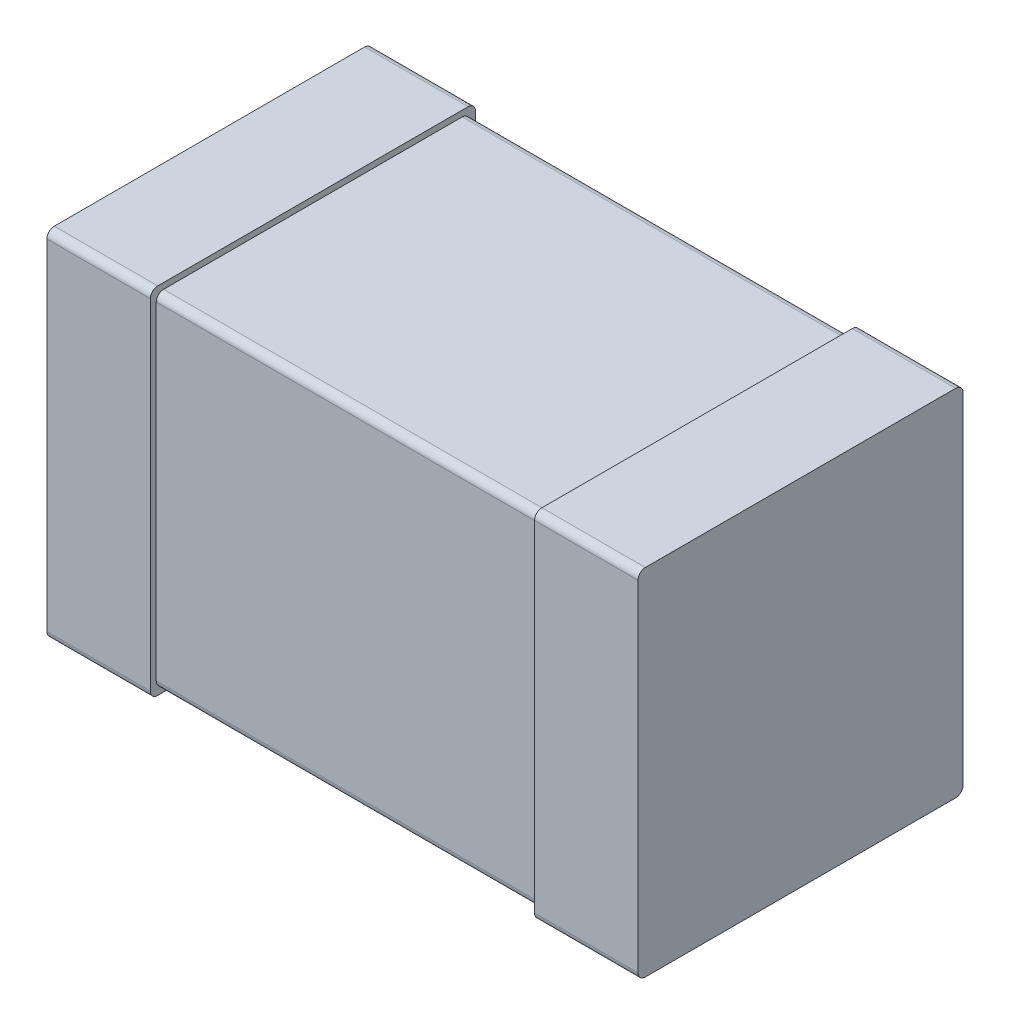
ISO-10303-21;
HEADER;
FILE_DESCRIPTION(('STEP AP214'),'2;1');
FILE_NAME('part.step','',(''),(''),'','','');
FILE_SCHEMA(('AUTOMOTIVE_DESIGN { 1 0 10303 214 1 1 1 1 }'));
ENDSEC;
DATA;
#1=APPLICATION_CONTEXT('core data for automotive mechanical design processes');
#2=APPLICATION_PROTOCOL_DEFINITION('international standard','automotive_design',2000,#1);
#3=PRODUCT_CONTEXT('',#1,'mechanical');
#4=PRODUCT('Part','Part','',(#3));
#5=PRODUCT_RELATED_PRODUCT_CATEGORY('part','',(#4));
#6=PRODUCT_DEFINITION_FORMATION('','',#4);
#7=PRODUCT_DEFINITION_CONTEXT('part definition',#1,'design');
#8=PRODUCT_DEFINITION('design','',#6,#7);
#9=PRODUCT_DEFINITION_SHAPE('','',#8);
#10=(LENGTH_UNIT() NAMED_UNIT(*) SI_UNIT(.MILLI.,.METRE.));
#11=(NAMED_UNIT(*) PLANE_ANGLE_UNIT() SI_UNIT($,.RADIAN.));
#12=(NAMED_UNIT(*) SI_UNIT($,.STERADIAN.) SOLID_ANGLE_UNIT());
#13=UNCERTAINTY_MEASURE_WITH_UNIT(LENGTH_MEASURE(1.E-05),#10,'distance_accuracy_value','');
#14=(GEOMETRIC_REPRESENTATION_CONTEXT(3) GLOBAL_UNCERTAINTY_ASSIGNED_CONTEXT((#13)) GLOBAL_UNIT_ASSIGNED_CONTEXT((#10,
#11,#12)) REPRESENTATION_CONTEXT('',''));
#15=CARTESIAN_POINT('',(0.,0.,0.));
#16=DIRECTION('',(0.,0.,1.));
#17=DIRECTION('',(1.,0.,0.));
#18=AXIS2_PLACEMENT_3D('',#15,#16,#17);
#19=CARTESIAN_POINT('',(-1.,-0.6,0.));
#20=DIRECTION('',(1.,0.,0.));
#21=DIRECTION('',(0.,0.,-1.));
#22=AXIS2_PLACEMENT_3D('',#19,#20,#21);
#23=PLANE('',#22);
#24=DIRECTION('',(0.,1.,0.));
#25=VECTOR('',#24,1.);
#26=CARTESIAN_POINT('',(-1.,-0.6,1.1));
#27=LINE('',#26,#25);
#28=CARTESIAN_POINT('',(-1.,0.575,1.1));
#29=VERTEX_POINT('',#28);
#30=CARTESIAN_POINT('',(-1.,-0.575,1.1));
#31=VERTEX_POINT('',#30);
#32=EDGE_CURVE('E294',#29,#31,#27,.F.);
#33=ORIENTED_EDGE('',*,*,#32,.F.);
#34=CARTESIAN_POINT('',(-1.,0.575,1.075));
#35=DIRECTION('',(1.,0.,0.));
#36=DIRECTION('',(0.,0.,-1.));
#37=AXIS2_PLACEMENT_3D('',#34,#35,#36);
#38=CIRCLE('',#37,0.025);
#39=CARTESIAN_POINT('',(-1.,0.6,1.075));
#40=VERTEX_POINT('',#39);
#41=EDGE_CURVE('E298',#40,#29,#38,.T.);
#42=ORIENTED_EDGE('',*,*,#41,.F.);
#43=DIRECTION('',(0.,0.,1.));
#44=VECTOR('',#43,1.);
#45=CARTESIAN_POINT('',(-1.,0.6,0.));
#46=LINE('',#45,#44);
#47=CARTESIAN_POINT('',(-1.,0.6,0.025));
#48=VERTEX_POINT('',#47);
#49=EDGE_CURVE('E302',#48,#40,#46,.T.);
#50=ORIENTED_EDGE('',*,*,#49,.F.);
#51=CARTESIAN_POINT('',(-1.,0.575,0.025));
#52=DIRECTION('',(1.,0.,0.));
#53=DIRECTION('',(0.,0.,-1.));
#54=AXIS2_PLACEMENT_3D('',#51,#52,#53);
#55=CIRCLE('',#54,0.025);
#56=CARTESIAN_POINT('',(-1.,0.575,0.));
#57=VERTEX_POINT('',#56);
#58=EDGE_CURVE('E303',#57,#48,#55,.T.);
#59=ORIENTED_EDGE('',*,*,#58,.F.);
#60=DIRECTION('',(0.,1.,0.));
#61=VECTOR('',#60,1.);
#62=CARTESIAN_POINT('',(-1.,-0.6,0.));
#63=LINE('',#62,#61);
#64=CARTESIAN_POINT('',(-1.,-0.575,0.));
#65=VERTEX_POINT('',#64);
#66=EDGE_CURVE('E310',#57,#65,#63,.F.);
#67=ORIENTED_EDGE('',*,*,#66,.T.);
#68=CARTESIAN_POINT('',(-1.,-0.575,0.025));
#69=DIRECTION('',(1.,0.,0.));
#70=DIRECTION('',(0.,0.,-1.));
#71=AXIS2_PLACEMENT_3D('',#68,#69,#70);
#72=CIRCLE('',#71,0.025);
#73=CARTESIAN_POINT('',(-1.,-0.6,0.025));
#74=VERTEX_POINT('',#73);
#75=EDGE_CURVE('E314',#74,#65,#72,.T.);
#76=ORIENTED_EDGE('',*,*,#75,.F.);
#77=DIRECTION('',(0.,0.,1.));
#78=VECTOR('',#77,1.);
#79=CARTESIAN_POINT('',(-1.,-0.6,0.));
#80=LINE('',#79,#78);
#81=CARTESIAN_POINT('',(-1.,-0.6,1.075));
#82=VERTEX_POINT('',#81);
#83=EDGE_CURVE('E323',#74,#82,#80,.T.);
#84=ORIENTED_EDGE('',*,*,#83,.T.);
#85=CARTESIAN_POINT('',(-1.,-0.575,1.075));
#86=DIRECTION('',(1.,0.,0.));
#87=DIRECTION('',(0.,0.,-1.));
#88=AXIS2_PLACEMENT_3D('',#85,#86,#87);
#89=CIRCLE('',#88,0.025);
#90=EDGE_CURVE('E291',#31,#82,#89,.T.);
#91=ORIENTED_EDGE('',*,*,#90,.F.);
#92=EDGE_LOOP('',(#33,#42,#50,#59,#67,#76,#84,#91));
#93=FACE_BOUND('',#92,.T.);
#94=ADVANCED_FACE('F17',(#93),#23,.F.);
#95=CARTESIAN_POINT('',(1.,-0.6,0.));
#96=DIRECTION('',(1.,0.,0.));
#97=DIRECTION('',(0.,0.,-1.));
#98=AXIS2_PLACEMENT_3D('',#95,#96,#97);
#99=PLANE('',#98);
#100=DIRECTION('',(0.,1.,0.));
#101=VECTOR('',#100,1.);
#102=CARTESIAN_POINT('',(1.,-0.6,1.1));
#103=LINE('',#102,#101);
#104=CARTESIAN_POINT('',(1.,-0.575,1.1));
#105=VERTEX_POINT('',#104);
#106=CARTESIAN_POINT('',(1.,0.575,1.1));
#107=VERTEX_POINT('',#106);
#108=EDGE_CURVE('E268',#105,#107,#103,.T.);
#109=ORIENTED_EDGE('',*,*,#108,.F.);
#110=CARTESIAN_POINT('',(1.,-0.575,1.075));
#111=DIRECTION('',(1.,0.,0.));
#112=DIRECTION('',(0.,0.,-1.));
#113=AXIS2_PLACEMENT_3D('',#110,#111,#112);
#114=CIRCLE('',#113,0.025);
#115=CARTESIAN_POINT('',(1.,-0.6,1.075));
#116=VERTEX_POINT('',#115);
#117=EDGE_CURVE('E262',#116,#105,#114,.F.);
#118=ORIENTED_EDGE('',*,*,#117,.F.);
#119=DIRECTION('',(0.,0.,1.));
#120=VECTOR('',#119,1.);
#121=CARTESIAN_POINT('',(1.,-0.6,0.));
#122=LINE('',#121,#120);
#123=CARTESIAN_POINT('',(1.,-0.6,0.025));
#124=VERTEX_POINT('',#123);
#125=EDGE_CURVE('E316',#116,#124,#122,.F.);
#126=ORIENTED_EDGE('',*,*,#125,.T.);
#127=CARTESIAN_POINT('',(1.,-0.575,0.025));
#128=DIRECTION('',(1.,0.,0.));
#129=DIRECTION('',(0.,0.,-1.));
#130=AXIS2_PLACEMENT_3D('',#127,#128,#129);
#131=CIRCLE('',#130,0.025);
#132=CARTESIAN_POINT('',(1.,-0.575,0.));
#133=VERTEX_POINT('',#132);
#134=EDGE_CURVE('E284',#133,#124,#131,.F.);
#135=ORIENTED_EDGE('',*,*,#134,.F.);
#136=DIRECTION('',(0.,1.,0.));
#137=VECTOR('',#136,1.);
#138=CARTESIAN_POINT('',(1.,-0.6,0.));
#139=LINE('',#138,#137);
#140=CARTESIAN_POINT('',(1.,0.575,0.));
#141=VERTEX_POINT('',#140);
#142=EDGE_CURVE('E281',#133,#141,#139,.T.);
#143=ORIENTED_EDGE('',*,*,#142,.T.);
#144=CARTESIAN_POINT('',(1.,0.575,0.025));
#145=DIRECTION('',(1.,0.,0.));
#146=DIRECTION('',(0.,0.,-1.));
#147=AXIS2_PLACEMENT_3D('',#144,#145,#146);
#148=CIRCLE('',#147,0.025);
#149=CARTESIAN_POINT('',(1.,0.6,0.025));
#150=VERTEX_POINT('',#149);
#151=EDGE_CURVE('E277',#150,#141,#148,.F.);
#152=ORIENTED_EDGE('',*,*,#151,.F.);
#153=DIRECTION('',(0.,0.,1.));
#154=VECTOR('',#153,1.);
#155=CARTESIAN_POINT('',(1.,0.6,0.));
#156=LINE('',#155,#154);
#157=CARTESIAN_POINT('',(1.,0.6,1.075));
#158=VERTEX_POINT('',#157);
#159=EDGE_CURVE('E274',#158,#150,#156,.F.);
#160=ORIENTED_EDGE('',*,*,#159,.F.);
#161=CARTESIAN_POINT('',(1.,0.575,1.075));
#162=DIRECTION('',(1.,0.,0.));
#163=DIRECTION('',(0.,0.,-1.));
#164=AXIS2_PLACEMENT_3D('',#161,#162,#163);
#165=CIRCLE('',#164,0.025);
#166=EDGE_CURVE('E271',#107,#158,#165,.F.);
#167=ORIENTED_EDGE('',*,*,#166,.F.);
#168=EDGE_LOOP('',(#109,#118,#126,#135,#143,#152,#160,#167));
#169=FACE_BOUND('',#168,.T.);
#170=ADVANCED_FACE('F392',(#169),#99,.T.);
#171=CARTESIAN_POINT('',(-0.65,-0.555,1.055));
#172=DIRECTION('',(1.,0.,0.));
#173=DIRECTION('',(0.,0.,-1.));
#174=AXIS2_PLACEMENT_3D('',#171,#172,#173);
#175=CYLINDRICAL_SURFACE('',#174,0.025);
#176=DIRECTION('',(1.,0.,0.));
#177=VECTOR('',#176,1.);
#178=CARTESIAN_POINT('',(-0.65,-0.555,1.08));
#179=LINE('',#178,#177);
#180=CARTESIAN_POINT('',(-0.65,-0.555,1.08));
#181=VERTEX_POINT('',#180);
#182=CARTESIAN_POINT('',(0.65,-0.555,1.08));
#183=VERTEX_POINT('',#182);
#184=EDGE_CURVE('E177',#181,#183,#179,.T.);
#185=ORIENTED_EDGE('',*,*,#184,.F.);
#186=CARTESIAN_POINT('',(-0.65,-0.555,1.055));
#187=DIRECTION('',(1.,0.,0.));
#188=DIRECTION('',(0.,0.,-1.));
#189=AXIS2_PLACEMENT_3D('',#186,#187,#188);
#190=CIRCLE('',#189,0.025);
#191=CARTESIAN_POINT('',(-0.65,-0.58,1.055));
#192=VERTEX_POINT('',#191);
#193=EDGE_CURVE('E182',#181,#192,#190,.T.);
#194=ORIENTED_EDGE('',*,*,#193,.T.);
#195=DIRECTION('',(1.,0.,0.));
#196=VECTOR('',#195,1.);
#197=CARTESIAN_POINT('',(-0.65,-0.58,1.055));
#198=LINE('',#197,#196);
#199=CARTESIAN_POINT('',(0.65,-0.58,1.055));
#200=VERTEX_POINT('',#199);
#201=EDGE_CURVE('E180',#192,#200,#198,.T.);
#202=ORIENTED_EDGE('',*,*,#201,.T.);
#203=CARTESIAN_POINT('',(0.65,-0.555,1.055));
#204=DIRECTION('',(1.,0.,0.));
#205=DIRECTION('',(0.,0.,-1.));
#206=AXIS2_PLACEMENT_3D('',#203,#204,#205);
#207=CIRCLE('',#206,0.025);
#208=EDGE_CURVE('E20',#200,#183,#207,.F.);
#209=ORIENTED_EDGE('',*,*,#208,.T.);
#210=EDGE_LOOP('',(#185,#194,#202,#209));
#211=FACE_BOUND('',#210,.T.);
#212=ADVANCED_FACE('F176',(#211),#175,.T.);
#213=CARTESIAN_POINT('',(-0.65,0.555,1.055));
#214=DIRECTION('',(1.,0.,0.));
#215=DIRECTION('',(0.,0.,-1.));
#216=AXIS2_PLACEMENT_3D('',#213,#214,#215);
#217=CYLINDRICAL_SURFACE('',#216,0.025);
#218=CARTESIAN_POINT('',(0.65,0.555,1.055));
#219=DIRECTION('',(1.,0.,0.));
#220=DIRECTION('',(0.,0.,-1.));
#221=AXIS2_PLACEMENT_3D('',#218,#219,#220);
#222=CIRCLE('',#221,0.025);
#223=CARTESIAN_POINT('',(0.65,0.555,1.08));
#224=VERTEX_POINT('',#223);
#225=CARTESIAN_POINT('',(0.65,0.58,1.055));
#226=VERTEX_POINT('',#225);
#227=EDGE_CURVE('E195',#224,#226,#222,.F.);
#228=ORIENTED_EDGE('',*,*,#227,.T.);
#229=DIRECTION('',(1.,0.,0.));
#230=VECTOR('',#229,1.);
#231=CARTESIAN_POINT('',(-0.65,0.58,1.055));
#232=LINE('',#231,#230);
#233=CARTESIAN_POINT('',(-0.65,0.58,1.055));
#234=VERTEX_POINT('',#233);
#235=EDGE_CURVE('E252',#234,#226,#232,.T.);
#236=ORIENTED_EDGE('',*,*,#235,.F.);
#237=CARTESIAN_POINT('',(-0.65,0.555,1.055));
#238=DIRECTION('',(1.,0.,0.));
#239=DIRECTION('',(0.,0.,-1.));
#240=AXIS2_PLACEMENT_3D('',#237,#238,#239);
#241=CIRCLE('',#240,0.025);
#242=CARTESIAN_POINT('',(-0.65,0.555,1.08));
#243=VERTEX_POINT('',#242);
#244=EDGE_CURVE('E357',#234,#243,#241,.T.);
#245=ORIENTED_EDGE('',*,*,#244,.T.);
#246=DIRECTION('',(1.,0.,0.));
#247=VECTOR('',#246,1.);
#248=CARTESIAN_POINT('',(-0.65,0.555,1.08));
#249=LINE('',#248,#247);
#250=EDGE_CURVE('E190',#224,#243,#249,.F.);
#251=ORIENTED_EDGE('',*,*,#250,.F.);
#252=EDGE_LOOP('',(#228,#236,#245,#251));
#253=FACE_BOUND('',#252,.T.);
#254=ADVANCED_FACE('F380',(#253),#217,.T.);
#255=CARTESIAN_POINT('',(-1.,-0.6,0.));
#256=DIRECTION('',(0.,1.,0.));
#257=DIRECTION('',(0.,0.,1.));
#258=AXIS2_PLACEMENT_3D('',#255,#256,#257);
#259=PLANE('',#258);
#260=ORIENTED_EDGE('',*,*,#83,.F.);
#261=DIRECTION('',(1.,0.,0.));
#262=VECTOR('',#261,1.);
#263=CARTESIAN_POINT('',(-1.,-0.6,0.025));
#264=LINE('',#263,#262);
#265=CARTESIAN_POINT('',(-0.65,-0.6,0.025));
#266=VERTEX_POINT('',#265);
#267=EDGE_CURVE('E311',#266,#74,#264,.F.);
#268=ORIENTED_EDGE('',*,*,#267,.F.);
#269=DIRECTION('',(0.,0.,-1.));
#270=VECTOR('',#269,1.);
#271=CARTESIAN_POINT('',(-0.65,-0.6,0.));
#272=LINE('',#271,#270);
#273=CARTESIAN_POINT('',(-0.65,-0.6,1.075));
#274=VERTEX_POINT('',#273);
#275=EDGE_CURVE('E250',#274,#266,#272,.T.);
#276=ORIENTED_EDGE('',*,*,#275,.F.);
#277=DIRECTION('',(1.,0.,0.));
#278=VECTOR('',#277,1.);
#279=CARTESIAN_POINT('',(-1.,-0.6,1.075));
#280=LINE('',#279,#278);
#281=EDGE_CURVE('E285',#82,#274,#280,.T.);
#282=ORIENTED_EDGE('',*,*,#281,.F.);
#283=EDGE_LOOP('',(#260,#268,#276,#282));
#284=FACE_BOUND('',#283,.T.);
#285=ADVANCED_FACE('F382',(#284),#259,.F.);
#286=CARTESIAN_POINT('',(-1.,-0.575,0.025));
#287=DIRECTION('',(1.,0.,0.));
#288=DIRECTION('',(0.,0.,-1.));
#289=AXIS2_PLACEMENT_3D('',#286,#287,#288);
#290=CYLINDRICAL_SURFACE('',#289,0.025);
#291=CARTESIAN_POINT('',(-0.65,-0.575,0.025));
#292=DIRECTION('',(1.,0.,0.));
#293=DIRECTION('',(0.,0.,-1.));
#294=AXIS2_PLACEMENT_3D('',#291,#292,#293);
#295=CIRCLE('',#294,0.025);
#296=CARTESIAN_POINT('',(-0.65,-0.575,0.));
#297=VERTEX_POINT('',#296);
#298=EDGE_CURVE('E249',#266,#297,#295,.T.);
#299=ORIENTED_EDGE('',*,*,#298,.F.);
#300=ORIENTED_EDGE('',*,*,#267,.T.);
#301=ORIENTED_EDGE('',*,*,#75,.T.);
#302=DIRECTION('',(1.,0.,0.));
#303=VECTOR('',#302,1.);
#304=CARTESIAN_POINT('',(-1.,-0.575,0.));
#305=LINE('',#304,#303);
#306=EDGE_CURVE('E307',#65,#297,#305,.T.);
#307=ORIENTED_EDGE('',*,*,#306,.T.);
#308=EDGE_LOOP('',(#299,#300,#301,#307));
#309=FACE_BOUND('',#308,.T.);
#310=ADVANCED_FACE('F389',(#309),#290,.T.);
#311=CARTESIAN_POINT('',(-1.,-0.6,0.));
#312=DIRECTION('',(0.,0.,1.));
#313=DIRECTION('',(1.,0.,0.));
#314=AXIS2_PLACEMENT_3D('',#311,#312,#313);
#315=PLANE('',#314);
#316=DIRECTION('',(0.,1.,0.));
#317=VECTOR('',#316,1.);
#318=CARTESIAN_POINT('',(-0.65,-0.6,0.));
#319=LINE('',#318,#317);
#320=CARTESIAN_POINT('',(-0.65,0.575,0.));
#321=VERTEX_POINT('',#320);
#322=EDGE_CURVE('E247',#297,#321,#319,.T.);
#323=ORIENTED_EDGE('',*,*,#322,.F.);
#324=ORIENTED_EDGE('',*,*,#306,.F.);
#325=ORIENTED_EDGE('',*,*,#66,.F.);
#326=DIRECTION('',(1.,0.,0.));
#327=VECTOR('',#326,1.);
#328=CARTESIAN_POINT('',(-1.,0.575,0.));
#329=LINE('',#328,#327);
#330=EDGE_CURVE('E304',#321,#57,#329,.F.);
#331=ORIENTED_EDGE('',*,*,#330,.F.);
#332=EDGE_LOOP('',(#323,#324,#325,#331));
#333=FACE_BOUND('',#332,.T.);
#334=ADVANCED_FACE('F464',(#333),#315,.F.);
#335=CARTESIAN_POINT('',(-1.,0.575,0.025));
#336=DIRECTION('',(1.,0.,0.));
#337=DIRECTION('',(0.,0.,-1.));
#338=AXIS2_PLACEMENT_3D('',#335,#336,#337);
#339=CYLINDRICAL_SURFACE('',#338,0.025);
#340=ORIENTED_EDGE('',*,*,#330,.T.);
#341=ORIENTED_EDGE('',*,*,#58,.T.);
#342=DIRECTION('',(1.,0.,0.));
#343=VECTOR('',#342,1.);
#344=CARTESIAN_POINT('',(-1.,0.6,0.025));
#345=LINE('',#344,#343);
#346=CARTESIAN_POINT('',(-0.65,0.6,0.025));
#347=VERTEX_POINT('',#346);
#348=EDGE_CURVE('E299',#347,#48,#345,.F.);
#349=ORIENTED_EDGE('',*,*,#348,.F.);
#350=CARTESIAN_POINT('',(-0.65,0.575,0.025));
#351=DIRECTION('',(1.,0.,0.));
#352=DIRECTION('',(0.,0.,-1.));
#353=AXIS2_PLACEMENT_3D('',#350,#351,#352);
#354=CIRCLE('',#353,0.025);
#355=EDGE_CURVE('E246',#321,#347,#354,.T.);
#356=ORIENTED_EDGE('',*,*,#355,.F.);
#357=EDGE_LOOP('',(#340,#341,#349,#356));
#358=FACE_BOUND('',#357,.T.);
#359=ADVANCED_FACE('F460',(#358),#339,.T.);
#360=CARTESIAN_POINT('',(-1.,0.6,0.));
#361=DIRECTION('',(0.,1.,0.));
#362=DIRECTION('',(0.,0.,1.));
#363=AXIS2_PLACEMENT_3D('',#360,#361,#362);
#364=PLANE('',#363);
#365=ORIENTED_EDGE('',*,*,#49,.T.);
#366=DIRECTION('',(1.,0.,0.));
#367=VECTOR('',#366,1.);
#368=CARTESIAN_POINT('',(-1.,0.6,1.075));
#369=LINE('',#368,#367);
#370=CARTESIAN_POINT('',(-0.65,0.6,1.075));
#371=VERTEX_POINT('',#370);
#372=EDGE_CURVE('E295',#371,#40,#369,.F.);
#373=ORIENTED_EDGE('',*,*,#372,.F.);
#374=DIRECTION('',(0.,0.,-1.));
#375=VECTOR('',#374,1.);
#376=CARTESIAN_POINT('',(-0.65,0.6,0.));
#377=LINE('',#376,#375);
#378=EDGE_CURVE('E244',#347,#371,#377,.F.);
#379=ORIENTED_EDGE('',*,*,#378,.F.);
#380=ORIENTED_EDGE('',*,*,#348,.T.);
#381=EDGE_LOOP('',(#365,#373,#379,#380));
#382=FACE_BOUND('',#381,.T.);
#383=ADVANCED_FACE('F456',(#382),#364,.T.);
#384=CARTESIAN_POINT('',(-1.,0.575,1.075));
#385=DIRECTION('',(1.,0.,0.));
#386=DIRECTION('',(0.,0.,-1.));
#387=AXIS2_PLACEMENT_3D('',#384,#385,#386);
#388=CYLINDRICAL_SURFACE('',#387,0.025);
#389=CARTESIAN_POINT('',(-0.65,0.575,1.075));
#390=DIRECTION('',(1.,0.,0.));
#391=DIRECTION('',(0.,0.,-1.));
#392=AXIS2_PLACEMENT_3D('',#389,#390,#391);
#393=CIRCLE('',#392,0.025);
#394=CARTESIAN_POINT('',(-0.65,0.575,1.1));
#395=VERTEX_POINT('',#394);
#396=EDGE_CURVE('E243',#371,#395,#393,.T.);
#397=ORIENTED_EDGE('',*,*,#396,.F.);
#398=ORIENTED_EDGE('',*,*,#372,.T.);
#399=ORIENTED_EDGE('',*,*,#41,.T.);
#400=DIRECTION('',(1.,0.,0.));
#401=VECTOR('',#400,1.);
#402=CARTESIAN_POINT('',(-1.,0.575,1.1));
#403=LINE('',#402,#401);
#404=EDGE_CURVE('E288',#395,#29,#403,.F.);
#405=ORIENTED_EDGE('',*,*,#404,.F.);
#406=EDGE_LOOP('',(#397,#398,#399,#405));
#407=FACE_BOUND('',#406,.T.);
#408=ADVANCED_FACE('F452',(#407),#388,.T.);
#409=CARTESIAN_POINT('',(-1.,-0.6,1.1));
#410=DIRECTION('',(0.,0.,1.));
#411=DIRECTION('',(1.,0.,0.));
#412=AXIS2_PLACEMENT_3D('',#409,#410,#411);
#413=PLANE('',#412);
#414=DIRECTION('',(0.,1.,0.));
#415=VECTOR('',#414,1.);
#416=CARTESIAN_POINT('',(-0.65,-0.6,1.1));
#417=LINE('',#416,#415);
#418=CARTESIAN_POINT('',(-0.65,-0.575,1.1));
#419=VERTEX_POINT('',#418);
#420=EDGE_CURVE('E241',#395,#419,#417,.F.);
#421=ORIENTED_EDGE('',*,*,#420,.F.);
#422=ORIENTED_EDGE('',*,*,#404,.T.);
#423=ORIENTED_EDGE('',*,*,#32,.T.);
#424=DIRECTION('',(1.,0.,0.));
#425=VECTOR('',#424,1.);
#426=CARTESIAN_POINT('',(-1.,-0.575,1.1));
#427=LINE('',#426,#425);
#428=EDGE_CURVE('E287',#419,#31,#427,.F.);
#429=ORIENTED_EDGE('',*,*,#428,.F.);
#430=EDGE_LOOP('',(#421,#422,#423,#429));
#431=FACE_BOUND('',#430,.T.);
#432=ADVANCED_FACE('F448',(#431),#413,.T.);
#433=CARTESIAN_POINT('',(-1.,-0.575,1.075));
#434=DIRECTION('',(1.,0.,0.));
#435=DIRECTION('',(0.,0.,-1.));
#436=AXIS2_PLACEMENT_3D('',#433,#434,#435);
#437=CYLINDRICAL_SURFACE('',#436,0.025);
#438=ORIENTED_EDGE('',*,*,#428,.T.);
#439=ORIENTED_EDGE('',*,*,#90,.T.);
#440=ORIENTED_EDGE('',*,*,#281,.T.);
#441=CARTESIAN_POINT('',(-0.65,-0.575,1.075));
#442=DIRECTION('',(1.,0.,0.));
#443=DIRECTION('',(0.,0.,-1.));
#444=AXIS2_PLACEMENT_3D('',#441,#442,#443);
#445=CIRCLE('',#444,0.025);
#446=EDGE_CURVE('E240',#419,#274,#445,.T.);
#447=ORIENTED_EDGE('',*,*,#446,.F.);
#448=EDGE_LOOP('',(#438,#439,#440,#447));
#449=FACE_BOUND('',#448,.T.);
#450=ADVANCED_FACE('F444',(#449),#437,.T.);
#451=CARTESIAN_POINT('',(0.65,-0.6,0.));
#452=DIRECTION('',(0.,1.,0.));
#453=DIRECTION('',(0.,0.,1.));
#454=AXIS2_PLACEMENT_3D('',#451,#452,#453);
#455=PLANE('',#454);
#456=DIRECTION('',(0.,0.,-1.));
#457=VECTOR('',#456,1.);
#458=CARTESIAN_POINT('',(0.65,-0.6,0.));
#459=LINE('',#458,#457);
#460=CARTESIAN_POINT('',(0.65,-0.6,1.075));
#461=VERTEX_POINT('',#460);
#462=CARTESIAN_POINT('',(0.65,-0.6,0.025));
#463=VERTEX_POINT('',#462);
#464=EDGE_CURVE('E219',#461,#463,#459,.T.);
#465=ORIENTED_EDGE('',*,*,#464,.T.);
#466=DIRECTION('',(1.,0.,0.));
#467=VECTOR('',#466,1.);
#468=CARTESIAN_POINT('',(0.65,-0.6,0.025));
#469=LINE('',#468,#467);
#470=EDGE_CURVE('E282',#124,#463,#469,.F.);
#471=ORIENTED_EDGE('',*,*,#470,.F.);
#472=ORIENTED_EDGE('',*,*,#125,.F.);
#473=DIRECTION('',(1.,0.,0.));
#474=VECTOR('',#473,1.);
#475=CARTESIAN_POINT('',(0.65,-0.6,1.075));
#476=LINE('',#475,#474);
#477=EDGE_CURVE('E263',#461,#116,#476,.T.);
#478=ORIENTED_EDGE('',*,*,#477,.F.);
#479=EDGE_LOOP('',(#465,#471,#472,#478));
#480=FACE_BOUND('',#479,.T.);
#481=ADVANCED_FACE('F440',(#480),#455,.F.);
#482=CARTESIAN_POINT('',(0.65,-0.575,0.025));
#483=DIRECTION('',(1.,0.,0.));
#484=DIRECTION('',(0.,0.,-1.));
#485=AXIS2_PLACEMENT_3D('',#482,#483,#484);
#486=CYLINDRICAL_SURFACE('',#485,0.025);
#487=ORIENTED_EDGE('',*,*,#134,.T.);
#488=ORIENTED_EDGE('',*,*,#470,.T.);
#489=CARTESIAN_POINT('',(0.65,-0.575,0.025));
#490=DIRECTION('',(1.,0.,0.));
#491=DIRECTION('',(0.,0.,-1.));
#492=AXIS2_PLACEMENT_3D('',#489,#490,#491);
#493=CIRCLE('',#492,0.025);
#494=CARTESIAN_POINT('',(0.65,-0.575,0.));
#495=VERTEX_POINT('',#494);
#496=EDGE_CURVE('E218',#463,#495,#493,.T.);
#497=ORIENTED_EDGE('',*,*,#496,.T.);
#498=DIRECTION('',(1.,0.,0.));
#499=VECTOR('',#498,1.);
#500=CARTESIAN_POINT('',(0.65,-0.575,0.));
#501=LINE('',#500,#499);
#502=EDGE_CURVE('E278',#495,#133,#501,.T.);
#503=ORIENTED_EDGE('',*,*,#502,.T.);
#504=EDGE_LOOP('',(#487,#488,#497,#503));
#505=FACE_BOUND('',#504,.T.);
#506=ADVANCED_FACE('F436',(#505),#486,.T.);
#507=CARTESIAN_POINT('',(0.65,-0.6,0.));
#508=DIRECTION('',(0.,0.,1.));
#509=DIRECTION('',(1.,0.,0.));
#510=AXIS2_PLACEMENT_3D('',#507,#508,#509);
#511=PLANE('',#510);
#512=ORIENTED_EDGE('',*,*,#142,.F.);
#513=ORIENTED_EDGE('',*,*,#502,.F.);
#514=DIRECTION('',(0.,1.,0.));
#515=VECTOR('',#514,1.);
#516=CARTESIAN_POINT('',(0.65,-0.6,0.));
#517=LINE('',#516,#515);
#518=CARTESIAN_POINT('',(0.65,0.575,0.));
#519=VERTEX_POINT('',#518);
#520=EDGE_CURVE('E215',#495,#519,#517,.T.);
#521=ORIENTED_EDGE('',*,*,#520,.T.);
#522=DIRECTION('',(1.,0.,0.));
#523=VECTOR('',#522,1.);
#524=CARTESIAN_POINT('',(0.65,0.575,0.));
#525=LINE('',#524,#523);
#526=EDGE_CURVE('E275',#141,#519,#525,.F.);
#527=ORIENTED_EDGE('',*,*,#526,.F.);
#528=EDGE_LOOP('',(#512,#513,#521,#527));
#529=FACE_BOUND('',#528,.T.);
#530=ADVANCED_FACE('F432',(#529),#511,.F.);
#531=CARTESIAN_POINT('',(0.65,0.575,0.025));
#532=DIRECTION('',(1.,0.,0.));
#533=DIRECTION('',(0.,0.,-1.));
#534=AXIS2_PLACEMENT_3D('',#531,#532,#533);
#535=CYLINDRICAL_SURFACE('',#534,0.025);
#536=ORIENTED_EDGE('',*,*,#526,.T.);
#537=CARTESIAN_POINT('',(0.65,0.575,0.025));
#538=DIRECTION('',(1.,0.,0.));
#539=DIRECTION('',(0.,0.,-1.));
#540=AXIS2_PLACEMENT_3D('',#537,#538,#539);
#541=CIRCLE('',#540,0.025);
#542=CARTESIAN_POINT('',(0.65,0.6,0.025));
#543=VERTEX_POINT('',#542);
#544=EDGE_CURVE('E214',#519,#543,#541,.T.);
#545=ORIENTED_EDGE('',*,*,#544,.T.);
#546=DIRECTION('',(1.,0.,0.));
#547=VECTOR('',#546,1.);
#548=CARTESIAN_POINT('',(0.65,0.6,0.025));
#549=LINE('',#548,#547);
#550=EDGE_CURVE('E272',#150,#543,#549,.F.);
#551=ORIENTED_EDGE('',*,*,#550,.F.);
#552=ORIENTED_EDGE('',*,*,#151,.T.);
#553=EDGE_LOOP('',(#536,#545,#551,#552));
#554=FACE_BOUND('',#553,.T.);
#555=ADVANCED_FACE('F428',(#554),#535,.T.);
#556=CARTESIAN_POINT('',(0.65,0.6,0.));
#557=DIRECTION('',(0.,1.,0.));
#558=DIRECTION('',(0.,0.,1.));
#559=AXIS2_PLACEMENT_3D('',#556,#557,#558);
#560=PLANE('',#559);
#561=DIRECTION('',(0.,0.,-1.));
#562=VECTOR('',#561,1.);
#563=CARTESIAN_POINT('',(0.65,0.6,0.));
#564=LINE('',#563,#562);
#565=CARTESIAN_POINT('',(0.65,0.6,1.075));
#566=VERTEX_POINT('',#565);
#567=EDGE_CURVE('E211',#543,#566,#564,.F.);
#568=ORIENTED_EDGE('',*,*,#567,.T.);
#569=DIRECTION('',(1.,0.,0.));
#570=VECTOR('',#569,1.);
#571=CARTESIAN_POINT('',(0.65,0.6,1.075));
#572=LINE('',#571,#570);
#573=EDGE_CURVE('E269',#158,#566,#572,.F.);
#574=ORIENTED_EDGE('',*,*,#573,.F.);
#575=ORIENTED_EDGE('',*,*,#159,.T.);
#576=ORIENTED_EDGE('',*,*,#550,.T.);
#577=EDGE_LOOP('',(#568,#574,#575,#576));
#578=FACE_BOUND('',#577,.T.);
#579=ADVANCED_FACE('F424',(#578),#560,.T.);
#580=CARTESIAN_POINT('',(0.65,0.575,1.075));
#581=DIRECTION('',(1.,0.,0.));
#582=DIRECTION('',(0.,0.,-1.));
#583=AXIS2_PLACEMENT_3D('',#580,#581,#582);
#584=CYLINDRICAL_SURFACE('',#583,0.025);
#585=ORIENTED_EDGE('',*,*,#166,.T.);
#586=ORIENTED_EDGE('',*,*,#573,.T.);
#587=CARTESIAN_POINT('',(0.65,0.575,1.075));
#588=DIRECTION('',(1.,0.,0.));
#589=DIRECTION('',(0.,0.,-1.));
#590=AXIS2_PLACEMENT_3D('',#587,#588,#589);
#591=CIRCLE('',#590,0.025);
#592=CARTESIAN_POINT('',(0.65,0.575,1.1));
#593=VERTEX_POINT('',#592);
#594=EDGE_CURVE('E210',#566,#593,#591,.T.);
#595=ORIENTED_EDGE('',*,*,#594,.T.);
#596=DIRECTION('',(1.,0.,0.));
#597=VECTOR('',#596,1.);
#598=CARTESIAN_POINT('',(0.65,0.575,1.1));
#599=LINE('',#598,#597);
#600=EDGE_CURVE('E266',#107,#593,#599,.F.);
#601=ORIENTED_EDGE('',*,*,#600,.F.);
#602=EDGE_LOOP('',(#585,#586,#595,#601));
#603=FACE_BOUND('',#602,.T.);
#604=ADVANCED_FACE('F420',(#603),#584,.T.);
#605=CARTESIAN_POINT('',(0.65,-0.6,1.1));
#606=DIRECTION('',(0.,0.,1.));
#607=DIRECTION('',(1.,0.,0.));
#608=AXIS2_PLACEMENT_3D('',#605,#606,#607);
#609=PLANE('',#608);
#610=ORIENTED_EDGE('',*,*,#108,.T.);
#611=ORIENTED_EDGE('',*,*,#600,.T.);
#612=DIRECTION('',(0.,1.,0.));
#613=VECTOR('',#612,1.);
#614=CARTESIAN_POINT('',(0.65,-0.6,1.1));
#615=LINE('',#614,#613);
#616=CARTESIAN_POINT('',(0.65,-0.575,1.1));
#617=VERTEX_POINT('',#616);
#618=EDGE_CURVE('E206',#593,#617,#615,.F.);
#619=ORIENTED_EDGE('',*,*,#618,.T.);
#620=DIRECTION('',(1.,0.,0.));
#621=VECTOR('',#620,1.);
#622=CARTESIAN_POINT('',(0.65,-0.575,1.1));
#623=LINE('',#622,#621);
#624=EDGE_CURVE('E258',#105,#617,#623,.F.);
#625=ORIENTED_EDGE('',*,*,#624,.F.);
#626=EDGE_LOOP('',(#610,#611,#619,#625));
#627=FACE_BOUND('',#626,.T.);
#628=ADVANCED_FACE('F416',(#627),#609,.T.);
#629=CARTESIAN_POINT('',(0.65,-0.575,1.075));
#630=DIRECTION('',(1.,0.,0.));
#631=DIRECTION('',(0.,0.,-1.));
#632=AXIS2_PLACEMENT_3D('',#629,#630,#631);
#633=CYLINDRICAL_SURFACE('',#632,0.025);
#634=ORIENTED_EDGE('',*,*,#624,.T.);
#635=CARTESIAN_POINT('',(0.65,-0.575,1.075));
#636=DIRECTION('',(1.,0.,0.));
#637=DIRECTION('',(0.,0.,-1.));
#638=AXIS2_PLACEMENT_3D('',#635,#636,#637);
#639=CIRCLE('',#638,0.025);
#640=EDGE_CURVE('E209',#617,#461,#639,.T.);
#641=ORIENTED_EDGE('',*,*,#640,.T.);
#642=ORIENTED_EDGE('',*,*,#477,.T.);
#643=ORIENTED_EDGE('',*,*,#117,.T.);
#644=EDGE_LOOP('',(#634,#641,#642,#643));
#645=FACE_BOUND('',#644,.T.);
#646=ADVANCED_FACE('F413',(#645),#633,.T.);
#647=CARTESIAN_POINT('',(-0.65,-0.58,0.02));
#648=DIRECTION('',(0.,1.,0.));
#649=DIRECTION('',(0.,0.,1.));
#650=AXIS2_PLACEMENT_3D('',#647,#648,#649);
#651=PLANE('',#650);
#652=DIRECTION('',(0.,0.,-1.));
#653=VECTOR('',#652,1.);
#654=CARTESIAN_POINT('',(-0.65,-0.58,0.));
#655=LINE('',#654,#653);
#656=CARTESIAN_POINT('',(-0.65,-0.58,0.045));
#657=VERTEX_POINT('',#656);
#658=EDGE_CURVE('E237',#657,#192,#655,.F.);
#659=ORIENTED_EDGE('',*,*,#658,.F.);
#660=DIRECTION('',(1.,0.,0.));
#661=VECTOR('',#660,1.);
#662=CARTESIAN_POINT('',(-0.65,-0.58,0.045));
#663=LINE('',#662,#661);
#664=CARTESIAN_POINT('',(0.65,-0.58,0.045));
#665=VERTEX_POINT('',#664);
#666=EDGE_CURVE('E222',#665,#657,#663,.F.);
#667=ORIENTED_EDGE('',*,*,#666,.F.);
#668=DIRECTION('',(0.,0.,-1.));
#669=VECTOR('',#668,1.);
#670=CARTESIAN_POINT('',(0.65,-0.58,0.));
#671=LINE('',#670,#669);
#672=EDGE_CURVE('E198',#665,#200,#671,.F.);
#673=ORIENTED_EDGE('',*,*,#672,.T.);
#674=ORIENTED_EDGE('',*,*,#201,.F.);
#675=EDGE_LOOP('',(#659,#667,#673,#674));
#676=FACE_BOUND('',#675,.T.);
#677=ADVANCED_FACE('F360',(#676),#651,.F.);
#678=CARTESIAN_POINT('',(-0.65,-0.58,1.08));
#679=DIRECTION('',(0.,0.,1.));
#680=DIRECTION('',(1.,0.,0.));
#681=AXIS2_PLACEMENT_3D('',#678,#679,#680);
#682=PLANE('',#681);
#683=DIRECTION('',(0.,1.,0.));
#684=VECTOR('',#683,1.);
#685=CARTESIAN_POINT('',(0.65,-0.6,1.08));
#686=LINE('',#685,#684);
#687=EDGE_CURVE('E187',#183,#224,#686,.T.);
#688=ORIENTED_EDGE('',*,*,#687,.T.);
#689=ORIENTED_EDGE('',*,*,#250,.T.);
#690=DIRECTION('',(0.,1.,0.));
#691=VECTOR('',#690,1.);
#692=CARTESIAN_POINT('',(-0.65,-0.6,1.08));
#693=LINE('',#692,#691);
#694=EDGE_CURVE('E189',#181,#243,#693,.T.);
#695=ORIENTED_EDGE('',*,*,#694,.F.);
#696=ORIENTED_EDGE('',*,*,#184,.T.);
#697=EDGE_LOOP('',(#688,#689,#695,#696));
#698=FACE_BOUND('',#697,.T.);
#699=ADVANCED_FACE('F185',(#698),#682,.T.);
#700=CARTESIAN_POINT('',(-0.65,0.58,0.02));
#701=DIRECTION('',(0.,1.,0.));
#702=DIRECTION('',(0.,0.,1.));
#703=AXIS2_PLACEMENT_3D('',#700,#701,#702);
#704=PLANE('',#703);
#705=DIRECTION('',(0.,0.,-1.));
#706=VECTOR('',#705,1.);
#707=CARTESIAN_POINT('',(-0.65,0.58,0.));
#708=LINE('',#707,#706);
#709=CARTESIAN_POINT('',(-0.65,0.58,0.045));
#710=VERTEX_POINT('',#709);
#711=EDGE_CURVE('E232',#234,#710,#708,.T.);
#712=ORIENTED_EDGE('',*,*,#711,.F.);
#713=ORIENTED_EDGE('',*,*,#235,.T.);
#714=DIRECTION('',(0.,0.,-1.));
#715=VECTOR('',#714,1.);
#716=CARTESIAN_POINT('',(0.65,0.58,0.));
#717=LINE('',#716,#715);
#718=CARTESIAN_POINT('',(0.65,0.58,0.045));
#719=VERTEX_POINT('',#718);
#720=EDGE_CURVE('E197',#226,#719,#717,.T.);
#721=ORIENTED_EDGE('',*,*,#720,.T.);
#722=DIRECTION('',(1.,0.,0.));
#723=VECTOR('',#722,1.);
#724=CARTESIAN_POINT('',(-0.65,0.58,0.045));
#725=LINE('',#724,#723);
#726=EDGE_CURVE('E201',#710,#719,#725,.T.);
#727=ORIENTED_EDGE('',*,*,#726,.F.);
#728=EDGE_LOOP('',(#712,#713,#721,#727));
#729=FACE_BOUND('',#728,.T.);
#730=ADVANCED_FACE('F378',(#729),#704,.T.);
#731=CARTESIAN_POINT('',(-0.65,-0.6,0.));
#732=DIRECTION('',(1.,0.,0.));
#733=DIRECTION('',(0.,0.,-1.));
#734=AXIS2_PLACEMENT_3D('',#731,#732,#733);
#735=PLANE('',#734);
#736=CARTESIAN_POINT('',(-0.65,0.555,0.045));
#737=DIRECTION('',(1.,0.,0.));
#738=DIRECTION('',(0.,0.,-1.));
#739=AXIS2_PLACEMENT_3D('',#736,#737,#738);
#740=CIRCLE('',#739,0.025);
#741=CARTESIAN_POINT('',(-0.65,0.555,0.02));
#742=VERTEX_POINT('',#741);
#743=EDGE_CURVE('E231',#742,#710,#740,.T.);
#744=ORIENTED_EDGE('',*,*,#743,.F.);
#745=DIRECTION('',(0.,1.,0.));
#746=VECTOR('',#745,1.);
#747=CARTESIAN_POINT('',(-0.65,-0.58,0.02));
#748=LINE('',#747,#746);
#749=CARTESIAN_POINT('',(-0.65,-0.555,0.02));
#750=VERTEX_POINT('',#749);
#751=EDGE_CURVE('E226',#742,#750,#748,.F.);
#752=ORIENTED_EDGE('',*,*,#751,.T.);
#753=CARTESIAN_POINT('',(-0.65,-0.555,0.045));
#754=DIRECTION('',(1.,0.,0.));
#755=DIRECTION('',(0.,0.,-1.));
#756=AXIS2_PLACEMENT_3D('',#753,#754,#755);
#757=CIRCLE('',#756,0.025);
#758=EDGE_CURVE('E235',#657,#750,#757,.T.);
#759=ORIENTED_EDGE('',*,*,#758,.F.);
#760=ORIENTED_EDGE('',*,*,#658,.T.);
#761=ORIENTED_EDGE('',*,*,#193,.F.);
#762=ORIENTED_EDGE('',*,*,#694,.T.);
#763=ORIENTED_EDGE('',*,*,#244,.F.);
#764=ORIENTED_EDGE('',*,*,#711,.T.);
#765=EDGE_LOOP('',(#744,#752,#759,#760,#761,#762,#763,#764));
#766=FACE_BOUND('',#765,.T.);
#767=ORIENTED_EDGE('',*,*,#420,.T.);
#768=ORIENTED_EDGE('',*,*,#446,.T.);
#769=ORIENTED_EDGE('',*,*,#275,.T.);
#770=ORIENTED_EDGE('',*,*,#298,.T.);
#771=ORIENTED_EDGE('',*,*,#322,.T.);
#772=ORIENTED_EDGE('',*,*,#355,.T.);
#773=ORIENTED_EDGE('',*,*,#378,.T.);
#774=ORIENTED_EDGE('',*,*,#396,.T.);
#775=EDGE_LOOP('',(#767,#768,#769,#770,#771,#772,#773,#774));
#776=FACE_BOUND('',#775,.T.);
#777=ADVANCED_FACE('F363',(#766,#776),#735,.T.);
#778=CARTESIAN_POINT('',(-0.65,-0.555,0.045));
#779=DIRECTION('',(1.,0.,0.));
#780=DIRECTION('',(0.,0.,-1.));
#781=AXIS2_PLACEMENT_3D('',#778,#779,#780);
#782=CYLINDRICAL_SURFACE('',#781,0.025);
#783=CARTESIAN_POINT('',(0.65,-0.555,0.045));
#784=DIRECTION('',(1.,0.,0.));
#785=DIRECTION('',(0.,0.,-1.));
#786=AXIS2_PLACEMENT_3D('',#783,#784,#785);
#787=CIRCLE('',#786,0.025);
#788=CARTESIAN_POINT('',(0.65,-0.555,0.02));
#789=VERTEX_POINT('',#788);
#790=EDGE_CURVE('E203',#789,#665,#787,.F.);
#791=ORIENTED_EDGE('',*,*,#790,.T.);
#792=ORIENTED_EDGE('',*,*,#666,.T.);
#793=ORIENTED_EDGE('',*,*,#758,.T.);
#794=DIRECTION('',(1.,0.,0.));
#795=VECTOR('',#794,1.);
#796=CARTESIAN_POINT('',(-0.65,-0.555,0.02));
#797=LINE('',#796,#795);
#798=EDGE_CURVE('E223',#750,#789,#797,.T.);
#799=ORIENTED_EDGE('',*,*,#798,.T.);
#800=EDGE_LOOP('',(#791,#792,#793,#799));
#801=FACE_BOUND('',#800,.T.);
#802=ADVANCED_FACE('F368',(#801),#782,.T.);
#803=CARTESIAN_POINT('',(0.65,-0.6,0.));
#804=DIRECTION('',(1.,0.,0.));
#805=DIRECTION('',(0.,0.,-1.));
#806=AXIS2_PLACEMENT_3D('',#803,#804,#805);
#807=PLANE('',#806);
#808=CARTESIAN_POINT('',(0.65,0.555,0.045));
#809=DIRECTION('',(1.,0.,0.));
#810=DIRECTION('',(0.,0.,-1.));
#811=AXIS2_PLACEMENT_3D('',#808,#809,#810);
#812=CIRCLE('',#811,0.025);
#813=CARTESIAN_POINT('',(0.65,0.555,0.02));
#814=VERTEX_POINT('',#813);
#815=EDGE_CURVE('E34',#719,#814,#812,.F.);
#816=ORIENTED_EDGE('',*,*,#815,.F.);
#817=ORIENTED_EDGE('',*,*,#720,.F.);
#818=ORIENTED_EDGE('',*,*,#227,.F.);
#819=ORIENTED_EDGE('',*,*,#687,.F.);
#820=ORIENTED_EDGE('',*,*,#208,.F.);
#821=ORIENTED_EDGE('',*,*,#672,.F.);
#822=ORIENTED_EDGE('',*,*,#790,.F.);
#823=DIRECTION('',(0.,1.,0.));
#824=VECTOR('',#823,1.);
#825=CARTESIAN_POINT('',(0.65,-0.58,0.02));
#826=LINE('',#825,#824);
#827=EDGE_CURVE('E26',#789,#814,#826,.T.);
#828=ORIENTED_EDGE('',*,*,#827,.T.);
#829=EDGE_LOOP('',(#816,#817,#818,#819,#820,#821,#822,#828));
#830=FACE_BOUND('',#829,.T.);
#831=ORIENTED_EDGE('',*,*,#618,.F.);
#832=ORIENTED_EDGE('',*,*,#594,.F.);
#833=ORIENTED_EDGE('',*,*,#567,.F.);
#834=ORIENTED_EDGE('',*,*,#544,.F.);
#835=ORIENTED_EDGE('',*,*,#520,.F.);
#836=ORIENTED_EDGE('',*,*,#496,.F.);
#837=ORIENTED_EDGE('',*,*,#464,.F.);
#838=ORIENTED_EDGE('',*,*,#640,.F.);
#839=EDGE_LOOP('',(#831,#832,#833,#834,#835,#836,#837,#838));
#840=FACE_BOUND('',#839,.T.);
#841=ADVANCED_FACE('F192',(#830,#840),#807,.F.);
#842=CARTESIAN_POINT('',(-0.65,0.555,0.045));
#843=DIRECTION('',(1.,0.,0.));
#844=DIRECTION('',(0.,0.,-1.));
#845=AXIS2_PLACEMENT_3D('',#842,#843,#844);
#846=CYLINDRICAL_SURFACE('',#845,0.025);
#847=DIRECTION('',(1.,0.,0.));
#848=VECTOR('',#847,1.);
#849=CARTESIAN_POINT('',(-0.65,0.555,0.02));
#850=LINE('',#849,#848);
#851=EDGE_CURVE('E11',#814,#742,#850,.F.);
#852=ORIENTED_EDGE('',*,*,#851,.T.);
#853=ORIENTED_EDGE('',*,*,#743,.T.);
#854=ORIENTED_EDGE('',*,*,#726,.T.);
#855=ORIENTED_EDGE('',*,*,#815,.T.);
#856=EDGE_LOOP('',(#852,#853,#854,#855));
#857=FACE_BOUND('',#856,.T.);
#858=ADVANCED_FACE('F377',(#857),#846,.T.);
#859=CARTESIAN_POINT('',(-0.65,-0.58,0.02));
#860=DIRECTION('',(0.,0.,1.));
#861=DIRECTION('',(1.,0.,0.));
#862=AXIS2_PLACEMENT_3D('',#859,#860,#861);
#863=PLANE('',#862);
#864=ORIENTED_EDGE('',*,*,#827,.F.);
#865=ORIENTED_EDGE('',*,*,#798,.F.);
#866=ORIENTED_EDGE('',*,*,#751,.F.);
#867=ORIENTED_EDGE('',*,*,#851,.F.);
#868=EDGE_LOOP('',(#864,#865,#866,#867));
#869=FACE_BOUND('',#868,.T.);
#870=ADVANCED_FACE('F371',(#869),#863,.F.);
#871=CLOSED_SHELL('',(#94,#170,#212,#254,#285,#310,#334,#359,#383,#408,#432,#450,#481,#506,#530,
#555,#579,#604,#628,#646,#677,#699,#730,#777,#802,#841,#858,#870));
#872=MANIFOLD_SOLID_BREP('B1',#871);
#873=ADVANCED_BREP_SHAPE_REPRESENTATION('',(#18,#872),#14);
#874=SHAPE_DEFINITION_REPRESENTATION(#9,#873);
ENDSEC;
END-ISO-10303-21;
